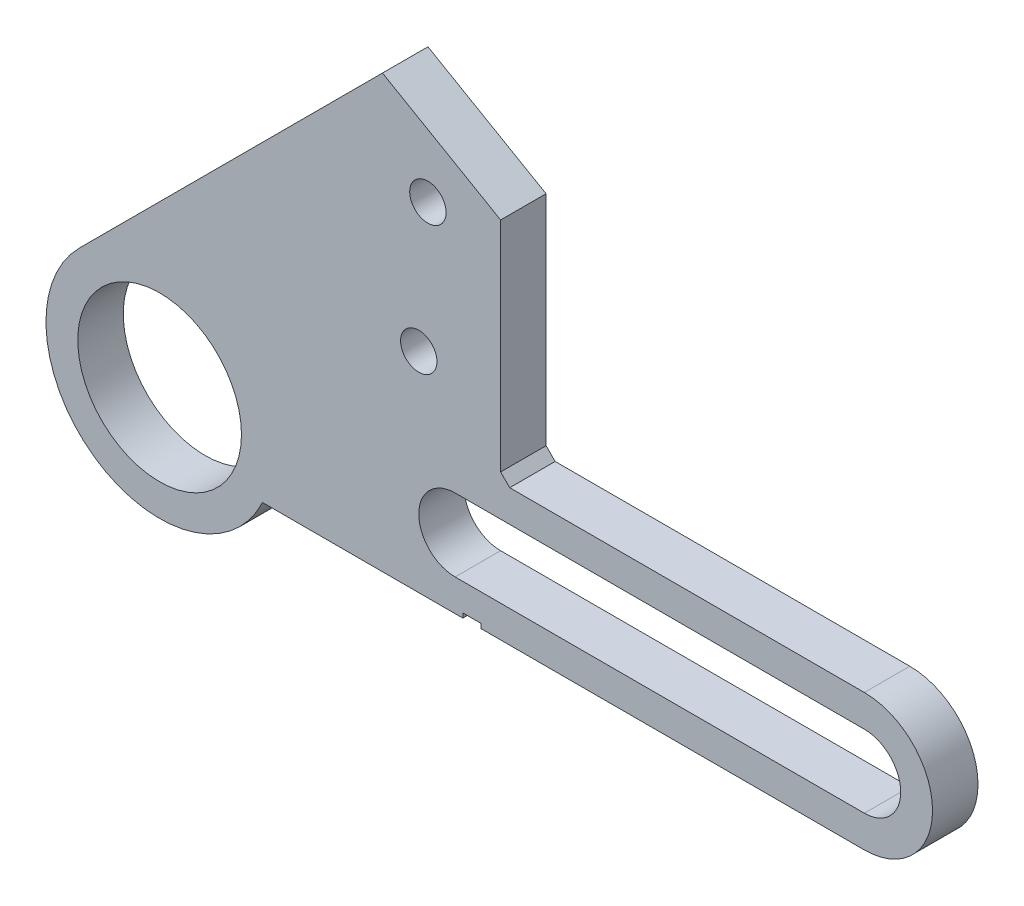
ISO-10303-21;
HEADER;
FILE_DESCRIPTION(('STEP AP214'),'2;1');
FILE_NAME('part.step','',(''),(''),'','','');
FILE_SCHEMA(('AUTOMOTIVE_DESIGN { 1 0 10303 214 1 1 1 1 }'));
ENDSEC;
DATA;
#1=APPLICATION_CONTEXT('core data for automotive mechanical design processes');
#2=APPLICATION_PROTOCOL_DEFINITION('international standard','automotive_design',2000,#1);
#3=PRODUCT_CONTEXT('',#1,'mechanical');
#4=PRODUCT('Part','Part','',(#3));
#5=PRODUCT_RELATED_PRODUCT_CATEGORY('part','',(#4));
#6=PRODUCT_DEFINITION_FORMATION('','',#4);
#7=PRODUCT_DEFINITION_CONTEXT('part definition',#1,'design');
#8=PRODUCT_DEFINITION('design','',#6,#7);
#9=PRODUCT_DEFINITION_SHAPE('','',#8);
#10=(LENGTH_UNIT() NAMED_UNIT(*) SI_UNIT(.MILLI.,.METRE.));
#11=(NAMED_UNIT(*) PLANE_ANGLE_UNIT() SI_UNIT($,.RADIAN.));
#12=(NAMED_UNIT(*) SI_UNIT($,.STERADIAN.) SOLID_ANGLE_UNIT());
#13=UNCERTAINTY_MEASURE_WITH_UNIT(LENGTH_MEASURE(1.E-05),#10,'distance_accuracy_value','');
#14=(GEOMETRIC_REPRESENTATION_CONTEXT(3) GLOBAL_UNCERTAINTY_ASSIGNED_CONTEXT((#13)) GLOBAL_UNIT_ASSIGNED_CONTEXT((#10,
#11,#12)) REPRESENTATION_CONTEXT('',''));
#15=CARTESIAN_POINT('',(0.,0.,0.));
#16=DIRECTION('',(0.,0.,1.));
#17=DIRECTION('',(1.,0.,0.));
#18=AXIS2_PLACEMENT_3D('',#15,#16,#17);
#19=CARTESIAN_POINT('',(11.3148175517677,-5.31271152710273,5.));
#20=DIRECTION('',(0.,1.,0.));
#21=DIRECTION('',(0.,0.,1.));
#22=AXIS2_PLACEMENT_3D('',#19,#20,#21);
#23=PLANE('',#22);
#24=DIRECTION('',(1.,0.,0.));
#25=VECTOR('',#24,1.);
#26=CARTESIAN_POINT('',(11.3148175517677,-5.31271152710273,0.));
#27=LINE('',#26,#25);
#28=CARTESIAN_POINT('',(11.3148175517677,-5.31271152710273,0.));
#29=VERTEX_POINT('',#28);
#30=CARTESIAN_POINT('',(33.3435858680399,-5.31271152710273,0.));
#31=VERTEX_POINT('',#30);
#32=EDGE_CURVE('E255',#29,#31,#27,.T.);
#33=ORIENTED_EDGE('',*,*,#32,.T.);
#34=DIRECTION('',(0.,0.,1.));
#35=VECTOR('',#34,1.);
#36=CARTESIAN_POINT('',(33.3435858680399,-5.31271152710273,5.));
#37=LINE('',#36,#35);
#38=CARTESIAN_POINT('',(33.3435858680399,-5.31271152710273,5.));
#39=VERTEX_POINT('',#38);
#40=EDGE_CURVE('E11',#31,#39,#37,.T.);
#41=ORIENTED_EDGE('',*,*,#40,.T.);
#42=DIRECTION('',(1.,0.,0.));
#43=VECTOR('',#42,1.);
#44=CARTESIAN_POINT('',(11.3148175517677,-5.31271152710273,5.));
#45=LINE('',#44,#43);
#46=CARTESIAN_POINT('',(11.3148175517677,-5.31271152710273,5.));
#47=VERTEX_POINT('',#46);
#48=EDGE_CURVE('E238',#47,#39,#45,.T.);
#49=ORIENTED_EDGE('',*,*,#48,.F.);
#50=DIRECTION('',(0.,0.,-1.));
#51=VECTOR('',#50,1.);
#52=CARTESIAN_POINT('',(11.3148175517677,-5.31271152710273,5.));
#53=LINE('',#52,#51);
#54=EDGE_CURVE('E270',#47,#29,#53,.T.);
#55=ORIENTED_EDGE('',*,*,#54,.T.);
#56=EDGE_LOOP('',(#33,#41,#49,#55));
#57=FACE_BOUND('',#56,.T.);
#58=ADVANCED_FACE('F33',(#57),#23,.F.);
#59=CARTESIAN_POINT('',(0.,0.,5.));
#60=DIRECTION('',(0.,0.,1.));
#61=DIRECTION('',(1.,0.,0.));
#62=AXIS2_PLACEMENT_3D('',#59,#60,#61);
#63=PLANE('',#62);
#64=DIRECTION('',(0.,-1.,0.));
#65=VECTOR('',#64,1.);
#66=CARTESIAN_POINT('',(33.3435858680399,0.,5.));
#67=LINE('',#66,#65);
#68=CARTESIAN_POINT('',(33.3435858680399,-4.81271152710273,5.));
#69=VERTEX_POINT('',#68);
#70=EDGE_CURVE('E176',#69,#39,#67,.T.);
#71=ORIENTED_EDGE('',*,*,#70,.F.);
#72=DIRECTION('',(-1.,0.,0.));
#73=VECTOR('',#72,1.);
#74=CARTESIAN_POINT('',(0.,-4.81271152710271,5.));
#75=LINE('',#74,#73);
#76=CARTESIAN_POINT('',(35.3435858680399,-4.81271152710273,5.));
#77=VERTEX_POINT('',#76);
#78=EDGE_CURVE('E155',#77,#69,#75,.T.);
#79=ORIENTED_EDGE('',*,*,#78,.F.);
#80=DIRECTION('',(0.,1.,0.));
#81=VECTOR('',#80,1.);
#82=CARTESIAN_POINT('',(35.3435858680399,0.,5.));
#83=LINE('',#82,#81);
#84=CARTESIAN_POINT('',(35.3435858680399,-5.31271152710273,5.));
#85=VERTEX_POINT('',#84);
#86=EDGE_CURVE('E173',#85,#77,#83,.T.);
#87=ORIENTED_EDGE('',*,*,#86,.F.);
#88=CARTESIAN_POINT('',(77.5,-5.31271152710273,5.));
#89=VERTEX_POINT('',#88);
#90=EDGE_CURVE('E237',#85,#89,#45,.T.);
#91=ORIENTED_EDGE('',*,*,#90,.T.);
#92=CARTESIAN_POINT('',(77.5,2.18728847289727,5.));
#93=DIRECTION('',(0.,0.,1.));
#94=DIRECTION('',(1.,0.,0.));
#95=AXIS2_PLACEMENT_3D('',#92,#93,#94);
#96=CIRCLE('',#95,7.5);
#97=CARTESIAN_POINT('',(77.5,9.68728847289727,5.));
#98=VERTEX_POINT('',#97);
#99=EDGE_CURVE('E241',#89,#98,#96,.T.);
#100=ORIENTED_EDGE('',*,*,#99,.T.);
#101=DIRECTION('',(-1.,0.,0.));
#102=VECTOR('',#101,1.);
#103=CARTESIAN_POINT('',(37.5,9.68728847289727,5.));
#104=LINE('',#103,#102);
#105=CARTESIAN_POINT('',(38.5,9.68728847289727,5.));
#106=VERTEX_POINT('',#105);
#107=EDGE_CURVE('E243',#98,#106,#104,.T.);
#108=ORIENTED_EDGE('',*,*,#107,.T.);
#109=DIRECTION('',(0.707106781186543,-0.707106781186552,0.));
#110=VECTOR('',#109,1.);
#111=CARTESIAN_POINT('',(37.5,10.6872884728973,5.));
#112=LINE('',#111,#110);
#113=CARTESIAN_POINT('',(37.5,10.6872884728973,5.));
#114=VERTEX_POINT('',#113);
#115=EDGE_CURVE('E285',#106,#114,#112,.F.);
#116=ORIENTED_EDGE('',*,*,#115,.T.);
#117=DIRECTION('',(0.,1.,0.));
#118=VECTOR('',#117,1.);
#119=CARTESIAN_POINT('',(37.5,34.6872884728973,5.));
#120=LINE('',#119,#118);
#121=CARTESIAN_POINT('',(37.5,34.6872884728973,5.));
#122=VERTEX_POINT('',#121);
#123=EDGE_CURVE('E245',#114,#122,#120,.T.);
#124=ORIENTED_EDGE('',*,*,#123,.T.);
#125=DIRECTION('',(-0.866025403784442,0.499999999999994,0.));
#126=VECTOR('',#125,1.);
#127=CARTESIAN_POINT('',(37.5,34.6872884728973,5.));
#128=LINE('',#127,#126);
#129=CARTESIAN_POINT('',(24.5096189432334,42.1872884728972,5.));
#130=VERTEX_POINT('',#129);
#131=EDGE_CURVE('E229',#122,#130,#128,.T.);
#132=ORIENTED_EDGE('',*,*,#131,.T.);
#133=DIRECTION('',(-0.707106781186546,-0.707106781186549,0.));
#134=VECTOR('',#133,1.);
#135=CARTESIAN_POINT('',(-8.83883476483186,8.83883476483183,5.));
#136=LINE('',#135,#134);
#137=CARTESIAN_POINT('',(-8.83883476483187,8.83883476483183,5.));
#138=VERTEX_POINT('',#137);
#139=EDGE_CURVE('E232',#130,#138,#136,.T.);
#140=ORIENTED_EDGE('',*,*,#139,.T.);
#141=CARTESIAN_POINT('',(0.,0.,5.));
#142=DIRECTION('',(0.,0.,1.));
#143=DIRECTION('',(1.,0.,0.));
#144=AXIS2_PLACEMENT_3D('',#141,#142,#143);
#145=CIRCLE('',#144,12.5);
#146=EDGE_CURVE('E235',#138,#47,#145,.T.);
#147=ORIENTED_EDGE('',*,*,#146,.T.);
#148=ORIENTED_EDGE('',*,*,#48,.T.);
#149=EDGE_LOOP('',(#71,#79,#87,#91,#100,#108,#116,#124,#132,#140,#147,#148));
#150=FACE_BOUND('',#149,.T.);
#151=CARTESIAN_POINT('',(28.5,17.6872884728973,5.));
#152=DIRECTION('',(0.,0.,-1.));
#153=DIRECTION('',(-1.,0.,0.));
#154=AXIS2_PLACEMENT_3D('',#151,#152,#153);
#155=CIRCLE('',#154,2.);
#156=CARTESIAN_POINT('',(26.5,17.6872884728973,5.));
#157=VERTEX_POINT('',#156);
#158=EDGE_CURVE('E180',#157,#157,#155,.T.);
#159=ORIENTED_EDGE('',*,*,#158,.T.);
#160=EDGE_LOOP('',(#159));
#161=FACE_BOUND('',#160,.T.);
#162=CARTESIAN_POINT('',(29.5,32.3842269295963,5.));
#163=DIRECTION('',(0.,0.,-1.));
#164=DIRECTION('',(-1.,0.,0.));
#165=AXIS2_PLACEMENT_3D('',#162,#163,#164);
#166=CIRCLE('',#165,2.);
#167=CARTESIAN_POINT('',(27.5,32.3842269295963,5.));
#168=VERTEX_POINT('',#167);
#169=EDGE_CURVE('E187',#168,#168,#166,.T.);
#170=ORIENTED_EDGE('',*,*,#169,.T.);
#171=EDGE_LOOP('',(#170));
#172=FACE_BOUND('',#171,.T.);
#173=DIRECTION('',(1.,0.,0.));
#174=VECTOR('',#173,1.);
#175=CARTESIAN_POINT('',(77.5,-1.81271152710273,5.));
#176=LINE('',#175,#174);
#177=CARTESIAN_POINT('',(32.5,-1.81271152710273,5.));
#178=VERTEX_POINT('',#177);
#179=CARTESIAN_POINT('',(77.5,-1.81271152710273,5.));
#180=VERTEX_POINT('',#179);
#181=EDGE_CURVE('E200',#178,#180,#176,.T.);
#182=ORIENTED_EDGE('',*,*,#181,.F.);
#183=CARTESIAN_POINT('',(32.5,2.18728847289727,5.));
#184=DIRECTION('',(0.,0.,1.));
#185=DIRECTION('',(1.,0.,0.));
#186=AXIS2_PLACEMENT_3D('',#183,#184,#185);
#187=CIRCLE('',#186,4.00000000000003);
#188=CARTESIAN_POINT('',(32.4999992793824,6.18728847289727,5.));
#189=VERTEX_POINT('',#188);
#190=EDGE_CURVE('E198',#189,#178,#187,.T.);
#191=ORIENTED_EDGE('',*,*,#190,.F.);
#192=DIRECTION('',(-1.,0.,0.));
#193=VECTOR('',#192,1.);
#194=CARTESIAN_POINT('',(77.5,6.18728847289727,5.));
#195=LINE('',#194,#193);
#196=CARTESIAN_POINT('',(77.5,6.18728847289727,5.));
#197=VERTEX_POINT('',#196);
#198=EDGE_CURVE('E206',#197,#189,#195,.T.);
#199=ORIENTED_EDGE('',*,*,#198,.F.);
#200=CARTESIAN_POINT('',(77.5,2.18728847289727,5.));
#201=DIRECTION('',(0.,0.,1.));
#202=DIRECTION('',(1.,0.,0.));
#203=AXIS2_PLACEMENT_3D('',#200,#201,#202);
#204=CIRCLE('',#203,4.);
#205=EDGE_CURVE('E203',#180,#197,#204,.T.);
#206=ORIENTED_EDGE('',*,*,#205,.F.);
#207=EDGE_LOOP('',(#182,#191,#199,#206));
#208=FACE_BOUND('',#207,.T.);
#209=CARTESIAN_POINT('',(0.,0.,5.));
#210=DIRECTION('',(0.,0.,1.));
#211=DIRECTION('',(1.,0.,0.));
#212=AXIS2_PLACEMENT_3D('',#209,#210,#211);
#213=CIRCLE('',#212,9.00000000000002);
#214=CARTESIAN_POINT('',(9.00000000000002,0.,5.));
#215=VERTEX_POINT('',#214);
#216=EDGE_CURVE('E192',#215,#215,#213,.T.);
#217=ORIENTED_EDGE('',*,*,#216,.F.);
#218=EDGE_LOOP('',(#217));
#219=FACE_BOUND('',#218,.T.);
#220=ADVANCED_FACE('F300',(#150,#161,#172,#208,#219),#63,.T.);
#221=CARTESIAN_POINT('',(0.,0.,0.));
#222=DIRECTION('',(0.,0.,1.));
#223=DIRECTION('',(1.,0.,0.));
#224=AXIS2_PLACEMENT_3D('',#221,#222,#223);
#225=PLANE('',#224);
#226=CARTESIAN_POINT('',(28.5,17.6872884728973,0.));
#227=DIRECTION('',(0.,0.,-1.));
#228=DIRECTION('',(-1.,0.,0.));
#229=AXIS2_PLACEMENT_3D('',#226,#227,#228);
#230=CIRCLE('',#229,2.);
#231=CARTESIAN_POINT('',(26.5,17.6872884728973,0.));
#232=VERTEX_POINT('',#231);
#233=EDGE_CURVE('E184',#232,#232,#230,.T.);
#234=ORIENTED_EDGE('',*,*,#233,.F.);
#235=EDGE_LOOP('',(#234));
#236=FACE_BOUND('',#235,.T.);
#237=CARTESIAN_POINT('',(29.5,32.3842269295963,0.));
#238=DIRECTION('',(0.,0.,-1.));
#239=DIRECTION('',(-1.,0.,0.));
#240=AXIS2_PLACEMENT_3D('',#237,#238,#239);
#241=CIRCLE('',#240,2.);
#242=CARTESIAN_POINT('',(27.5,32.3842269295963,0.));
#243=VERTEX_POINT('',#242);
#244=EDGE_CURVE('E179',#243,#243,#241,.T.);
#245=ORIENTED_EDGE('',*,*,#244,.F.);
#246=EDGE_LOOP('',(#245));
#247=FACE_BOUND('',#246,.T.);
#248=DIRECTION('',(1.,0.,0.));
#249=VECTOR('',#248,1.);
#250=CARTESIAN_POINT('',(33.3435858680399,-4.81271152710273,0.));
#251=LINE('',#250,#249);
#252=CARTESIAN_POINT('',(33.3435858680399,-4.81271152710273,0.));
#253=VERTEX_POINT('',#252);
#254=CARTESIAN_POINT('',(35.3435858680399,-4.81271152710273,0.));
#255=VERTEX_POINT('',#254);
#256=EDGE_CURVE('E153',#253,#255,#251,.T.);
#257=ORIENTED_EDGE('',*,*,#256,.F.);
#258=DIRECTION('',(0.,1.,0.));
#259=VECTOR('',#258,1.);
#260=CARTESIAN_POINT('',(33.3435858680399,-5.31271152710273,0.));
#261=LINE('',#260,#259);
#262=EDGE_CURVE('E161',#31,#253,#261,.T.);
#263=ORIENTED_EDGE('',*,*,#262,.F.);
#264=ORIENTED_EDGE('',*,*,#32,.F.);
#265=CARTESIAN_POINT('',(0.,0.,0.));
#266=DIRECTION('',(0.,0.,1.));
#267=DIRECTION('',(1.,0.,0.));
#268=AXIS2_PLACEMENT_3D('',#265,#266,#267);
#269=CIRCLE('',#268,12.5);
#270=CARTESIAN_POINT('',(-8.83883476483187,8.83883476483183,0.));
#271=VERTEX_POINT('',#270);
#272=EDGE_CURVE('E252',#271,#29,#269,.T.);
#273=ORIENTED_EDGE('',*,*,#272,.F.);
#274=DIRECTION('',(-0.707106781186546,-0.707106781186549,0.));
#275=VECTOR('',#274,1.);
#276=CARTESIAN_POINT('',(-8.83883476483186,8.83883476483183,0.));
#277=LINE('',#276,#275);
#278=CARTESIAN_POINT('',(24.5096189432334,42.1872884728972,0.));
#279=VERTEX_POINT('',#278);
#280=EDGE_CURVE('E250',#279,#271,#277,.T.);
#281=ORIENTED_EDGE('',*,*,#280,.F.);
#282=DIRECTION('',(-0.866025403784442,0.499999999999994,0.));
#283=VECTOR('',#282,1.);
#284=CARTESIAN_POINT('',(37.5,34.6872884728973,0.));
#285=LINE('',#284,#283);
#286=CARTESIAN_POINT('',(37.5,34.6872884728973,0.));
#287=VERTEX_POINT('',#286);
#288=EDGE_CURVE('E228',#287,#279,#285,.T.);
#289=ORIENTED_EDGE('',*,*,#288,.F.);
#290=DIRECTION('',(0.,1.,0.));
#291=VECTOR('',#290,1.);
#292=CARTESIAN_POINT('',(37.5,34.6872884728973,0.));
#293=LINE('',#292,#291);
#294=CARTESIAN_POINT('',(37.5,10.6872884728973,0.));
#295=VERTEX_POINT('',#294);
#296=EDGE_CURVE('E233',#295,#287,#293,.T.);
#297=ORIENTED_EDGE('',*,*,#296,.F.);
#298=DIRECTION('',(-0.707106781186543,0.707106781186552,0.));
#299=VECTOR('',#298,1.);
#300=CARTESIAN_POINT('',(24.0936442364489,24.0936442364486,0.));
#301=LINE('',#300,#299);
#302=CARTESIAN_POINT('',(38.5,9.68728847289727,0.));
#303=VERTEX_POINT('',#302);
#304=EDGE_CURVE('E283',#295,#303,#301,.F.);
#305=ORIENTED_EDGE('',*,*,#304,.T.);
#306=DIRECTION('',(-1.,0.,0.));
#307=VECTOR('',#306,1.);
#308=CARTESIAN_POINT('',(37.5,9.68728847289727,0.));
#309=LINE('',#308,#307);
#310=CARTESIAN_POINT('',(77.5,9.68728847289727,0.));
#311=VERTEX_POINT('',#310);
#312=EDGE_CURVE('E259',#311,#303,#309,.T.);
#313=ORIENTED_EDGE('',*,*,#312,.F.);
#314=CARTESIAN_POINT('',(77.5,2.18728847289727,0.));
#315=DIRECTION('',(0.,0.,1.));
#316=DIRECTION('',(1.,0.,0.));
#317=AXIS2_PLACEMENT_3D('',#314,#315,#316);
#318=CIRCLE('',#317,7.5);
#319=CARTESIAN_POINT('',(77.5,-5.31271152710273,0.));
#320=VERTEX_POINT('',#319);
#321=EDGE_CURVE('E257',#320,#311,#318,.T.);
#322=ORIENTED_EDGE('',*,*,#321,.F.);
#323=CARTESIAN_POINT('',(35.3435858680398,-5.31271152710273,0.));
#324=VERTEX_POINT('',#323);
#325=EDGE_CURVE('E254',#324,#320,#27,.T.);
#326=ORIENTED_EDGE('',*,*,#325,.F.);
#327=DIRECTION('',(0.,-1.,0.));
#328=VECTOR('',#327,1.);
#329=CARTESIAN_POINT('',(35.3435858680399,-5.31271152710273,0.));
#330=LINE('',#329,#328);
#331=EDGE_CURVE('E48',#255,#324,#330,.T.);
#332=ORIENTED_EDGE('',*,*,#331,.F.);
#333=EDGE_LOOP('',(#257,#263,#264,#273,#281,#289,#297,#305,#313,#322,#326,#332));
#334=FACE_BOUND('',#333,.T.);
#335=CARTESIAN_POINT('',(32.5,2.18728847289727,0.));
#336=DIRECTION('',(0.,0.,1.));
#337=DIRECTION('',(1.,0.,0.));
#338=AXIS2_PLACEMENT_3D('',#335,#336,#337);
#339=CIRCLE('',#338,4.00000000000003);
#340=CARTESIAN_POINT('',(32.4999992793824,6.18728847289727,0.));
#341=VERTEX_POINT('',#340);
#342=CARTESIAN_POINT('',(32.5,-1.81271152710273,0.));
#343=VERTEX_POINT('',#342);
#344=EDGE_CURVE('E195',#341,#343,#339,.T.);
#345=ORIENTED_EDGE('',*,*,#344,.T.);
#346=DIRECTION('',(1.,0.,0.));
#347=VECTOR('',#346,1.);
#348=CARTESIAN_POINT('',(77.5,-1.81271152710273,0.));
#349=LINE('',#348,#347);
#350=CARTESIAN_POINT('',(77.5,-1.81271152710273,0.));
#351=VERTEX_POINT('',#350);
#352=EDGE_CURVE('E211',#343,#351,#349,.T.);
#353=ORIENTED_EDGE('',*,*,#352,.T.);
#354=CARTESIAN_POINT('',(77.5,2.18728847289727,0.));
#355=DIRECTION('',(0.,0.,1.));
#356=DIRECTION('',(1.,0.,0.));
#357=AXIS2_PLACEMENT_3D('',#354,#355,#356);
#358=CIRCLE('',#357,4.);
#359=CARTESIAN_POINT('',(77.5,6.18728847289727,0.));
#360=VERTEX_POINT('',#359);
#361=EDGE_CURVE('E214',#351,#360,#358,.T.);
#362=ORIENTED_EDGE('',*,*,#361,.T.);
#363=DIRECTION('',(-1.,0.,0.));
#364=VECTOR('',#363,1.);
#365=CARTESIAN_POINT('',(77.5,6.18728847289727,0.));
#366=LINE('',#365,#364);
#367=EDGE_CURVE('E201',#360,#341,#366,.T.);
#368=ORIENTED_EDGE('',*,*,#367,.T.);
#369=EDGE_LOOP('',(#345,#353,#362,#368));
#370=FACE_BOUND('',#369,.T.);
#371=CARTESIAN_POINT('',(0.,0.,0.));
#372=DIRECTION('',(0.,0.,1.));
#373=DIRECTION('',(1.,0.,0.));
#374=AXIS2_PLACEMENT_3D('',#371,#372,#373);
#375=CIRCLE('',#374,9.00000000000002);
#376=CARTESIAN_POINT('',(9.00000000000002,0.,0.));
#377=VERTEX_POINT('',#376);
#378=EDGE_CURVE('E183',#377,#377,#375,.T.);
#379=ORIENTED_EDGE('',*,*,#378,.T.);
#380=EDGE_LOOP('',(#379));
#381=FACE_BOUND('',#380,.T.);
#382=ADVANCED_FACE('F167',(#236,#247,#334,#370,#381),#225,.F.);
#383=CARTESIAN_POINT('',(37.5,34.6872884728973,5.));
#384=DIRECTION('',(-0.499999999999994,-0.866025403784442,0.));
#385=DIRECTION('',(0.866025403784442,-0.499999999999994,0.));
#386=AXIS2_PLACEMENT_3D('',#383,#384,#385);
#387=PLANE('',#386);
#388=ORIENTED_EDGE('',*,*,#288,.T.);
#389=DIRECTION('',(0.,0.,-1.));
#390=VECTOR('',#389,1.);
#391=CARTESIAN_POINT('',(24.5096189432334,42.1872884728972,5.));
#392=LINE('',#391,#390);
#393=EDGE_CURVE('E276',#130,#279,#392,.T.);
#394=ORIENTED_EDGE('',*,*,#393,.F.);
#395=ORIENTED_EDGE('',*,*,#131,.F.);
#396=DIRECTION('',(0.,0.,-1.));
#397=VECTOR('',#396,1.);
#398=CARTESIAN_POINT('',(37.5,34.6872884728973,5.));
#399=LINE('',#398,#397);
#400=EDGE_CURVE('E247',#122,#287,#399,.T.);
#401=ORIENTED_EDGE('',*,*,#400,.T.);
#402=EDGE_LOOP('',(#388,#394,#395,#401));
#403=FACE_BOUND('',#402,.T.);
#404=ADVANCED_FACE('F313',(#403),#387,.F.);
#405=CARTESIAN_POINT('',(-8.83883476483186,8.83883476483183,5.));
#406=DIRECTION('',(0.707106781186549,-0.707106781186546,0.));
#407=DIRECTION('',(0.707106781186546,0.707106781186549,0.));
#408=AXIS2_PLACEMENT_3D('',#405,#406,#407);
#409=PLANE('',#408);
#410=ORIENTED_EDGE('',*,*,#280,.T.);
#411=DIRECTION('',(0.,0.,-1.));
#412=VECTOR('',#411,1.);
#413=CARTESIAN_POINT('',(-8.83883476483187,8.83883476483183,5.));
#414=LINE('',#413,#412);
#415=EDGE_CURVE('E273',#138,#271,#414,.T.);
#416=ORIENTED_EDGE('',*,*,#415,.F.);
#417=ORIENTED_EDGE('',*,*,#139,.F.);
#418=ORIENTED_EDGE('',*,*,#393,.T.);
#419=EDGE_LOOP('',(#410,#416,#417,#418));
#420=FACE_BOUND('',#419,.T.);
#421=ADVANCED_FACE('F319',(#420),#409,.F.);
#422=CARTESIAN_POINT('',(0.,0.,5.));
#423=DIRECTION('',(0.,0.,-1.));
#424=DIRECTION('',(-1.,0.,0.));
#425=AXIS2_PLACEMENT_3D('',#422,#423,#424);
#426=CYLINDRICAL_SURFACE('',#425,12.5);
#427=ORIENTED_EDGE('',*,*,#272,.T.);
#428=ORIENTED_EDGE('',*,*,#54,.F.);
#429=ORIENTED_EDGE('',*,*,#146,.F.);
#430=ORIENTED_EDGE('',*,*,#415,.T.);
#431=EDGE_LOOP('',(#427,#428,#429,#430));
#432=FACE_BOUND('',#431,.T.);
#433=ADVANCED_FACE('F321',(#432),#426,.T.);
#434=ORIENTED_EDGE('',*,*,#90,.F.);
#435=DIRECTION('',(0.,0.,-1.));
#436=VECTOR('',#435,1.);
#437=CARTESIAN_POINT('',(35.3435858680399,-5.31271152710273,5.));
#438=LINE('',#437,#436);
#439=EDGE_CURVE('E41',#85,#324,#438,.T.);
#440=ORIENTED_EDGE('',*,*,#439,.T.);
#441=ORIENTED_EDGE('',*,*,#325,.T.);
#442=DIRECTION('',(0.,0.,-1.));
#443=VECTOR('',#442,1.);
#444=CARTESIAN_POINT('',(77.5,-5.31271152710273,5.));
#445=LINE('',#444,#443);
#446=EDGE_CURVE('E267',#89,#320,#445,.T.);
#447=ORIENTED_EDGE('',*,*,#446,.F.);
#448=EDGE_LOOP('',(#434,#440,#441,#447));
#449=FACE_BOUND('',#448,.T.);
#450=ADVANCED_FACE('F288',(#449),#23,.F.);
#451=CARTESIAN_POINT('',(77.5,2.18728847289727,5.));
#452=DIRECTION('',(0.,0.,-1.));
#453=DIRECTION('',(-1.,0.,0.));
#454=AXIS2_PLACEMENT_3D('',#451,#452,#453);
#455=CYLINDRICAL_SURFACE('',#454,7.5);
#456=ORIENTED_EDGE('',*,*,#321,.T.);
#457=DIRECTION('',(0.,0.,-1.));
#458=VECTOR('',#457,1.);
#459=CARTESIAN_POINT('',(77.5,9.68728847289727,5.));
#460=LINE('',#459,#458);
#461=EDGE_CURVE('E264',#98,#311,#460,.T.);
#462=ORIENTED_EDGE('',*,*,#461,.F.);
#463=ORIENTED_EDGE('',*,*,#99,.F.);
#464=ORIENTED_EDGE('',*,*,#446,.T.);
#465=EDGE_LOOP('',(#456,#462,#463,#464));
#466=FACE_BOUND('',#465,.T.);
#467=ADVANCED_FACE('F295',(#466),#455,.T.);
#468=CARTESIAN_POINT('',(37.5,9.68728847289727,5.));
#469=DIRECTION('',(0.,-1.,0.));
#470=DIRECTION('',(0.,0.,-1.));
#471=AXIS2_PLACEMENT_3D('',#468,#469,#470);
#472=PLANE('',#471);
#473=ORIENTED_EDGE('',*,*,#312,.T.);
#474=DIRECTION('',(0.,0.,1.));
#475=VECTOR('',#474,1.);
#476=CARTESIAN_POINT('',(38.5,9.68728847289727,5.));
#477=LINE('',#476,#475);
#478=EDGE_CURVE('E56',#303,#106,#477,.T.);
#479=ORIENTED_EDGE('',*,*,#478,.T.);
#480=ORIENTED_EDGE('',*,*,#107,.F.);
#481=ORIENTED_EDGE('',*,*,#461,.T.);
#482=EDGE_LOOP('',(#473,#479,#480,#481));
#483=FACE_BOUND('',#482,.T.);
#484=ADVANCED_FACE('F297',(#483),#472,.F.);
#485=CARTESIAN_POINT('',(37.5,34.6872884728973,5.));
#486=DIRECTION('',(-1.,0.,0.));
#487=DIRECTION('',(0.,-1.,0.));
#488=AXIS2_PLACEMENT_3D('',#485,#486,#487);
#489=PLANE('',#488);
#490=ORIENTED_EDGE('',*,*,#123,.F.);
#491=DIRECTION('',(0.,0.,-1.));
#492=VECTOR('',#491,1.);
#493=CARTESIAN_POINT('',(37.5,10.6872884728973,0.));
#494=LINE('',#493,#492);
#495=EDGE_CURVE('E279',#114,#295,#494,.T.);
#496=ORIENTED_EDGE('',*,*,#495,.T.);
#497=ORIENTED_EDGE('',*,*,#296,.T.);
#498=ORIENTED_EDGE('',*,*,#400,.F.);
#499=EDGE_LOOP('',(#490,#496,#497,#498));
#500=FACE_BOUND('',#499,.T.);
#501=ADVANCED_FACE('F307',(#500),#489,.F.);
#502=CARTESIAN_POINT('',(32.5,2.18728847289727,5.));
#503=DIRECTION('',(0.,0.,-1.));
#504=DIRECTION('',(-1.,0.,0.));
#505=AXIS2_PLACEMENT_3D('',#502,#503,#504);
#506=CYLINDRICAL_SURFACE('',#505,4.00000000000003);
#507=ORIENTED_EDGE('',*,*,#344,.F.);
#508=DIRECTION('',(0.,0.,-1.));
#509=VECTOR('',#508,1.);
#510=CARTESIAN_POINT('',(32.4999992793824,6.18728847289727,5.));
#511=LINE('',#510,#509);
#512=EDGE_CURVE('E208',#189,#341,#511,.T.);
#513=ORIENTED_EDGE('',*,*,#512,.F.);
#514=ORIENTED_EDGE('',*,*,#190,.T.);
#515=DIRECTION('',(0.,0.,-1.));
#516=VECTOR('',#515,1.);
#517=CARTESIAN_POINT('',(32.5,-1.81271152710273,5.));
#518=LINE('',#517,#516);
#519=EDGE_CURVE('E225',#178,#343,#518,.T.);
#520=ORIENTED_EDGE('',*,*,#519,.T.);
#521=EDGE_LOOP('',(#507,#513,#514,#520));
#522=FACE_BOUND('',#521,.T.);
#523=ADVANCED_FACE('F364',(#522),#506,.F.);
#524=CARTESIAN_POINT('',(77.5,-1.81271152710273,5.));
#525=DIRECTION('',(0.,1.,0.));
#526=DIRECTION('',(-1.,0.,0.));
#527=AXIS2_PLACEMENT_3D('',#524,#525,#526);
#528=PLANE('',#527);
#529=ORIENTED_EDGE('',*,*,#352,.F.);
#530=ORIENTED_EDGE('',*,*,#519,.F.);
#531=ORIENTED_EDGE('',*,*,#181,.T.);
#532=DIRECTION('',(0.,0.,-1.));
#533=VECTOR('',#532,1.);
#534=CARTESIAN_POINT('',(77.5,-1.81271152710273,5.));
#535=LINE('',#534,#533);
#536=EDGE_CURVE('E223',#180,#351,#535,.T.);
#537=ORIENTED_EDGE('',*,*,#536,.T.);
#538=EDGE_LOOP('',(#529,#530,#531,#537));
#539=FACE_BOUND('',#538,.T.);
#540=ADVANCED_FACE('F382',(#539),#528,.T.);
#541=CARTESIAN_POINT('',(77.5,2.18728847289727,5.));
#542=DIRECTION('',(0.,0.,-1.));
#543=DIRECTION('',(-1.,0.,0.));
#544=AXIS2_PLACEMENT_3D('',#541,#542,#543);
#545=CYLINDRICAL_SURFACE('',#544,4.);
#546=ORIENTED_EDGE('',*,*,#361,.F.);
#547=ORIENTED_EDGE('',*,*,#536,.F.);
#548=ORIENTED_EDGE('',*,*,#205,.T.);
#549=DIRECTION('',(0.,0.,-1.));
#550=VECTOR('',#549,1.);
#551=CARTESIAN_POINT('',(77.5,6.18728847289727,5.));
#552=LINE('',#551,#550);
#553=EDGE_CURVE('E221',#197,#360,#552,.T.);
#554=ORIENTED_EDGE('',*,*,#553,.T.);
#555=EDGE_LOOP('',(#546,#547,#548,#554));
#556=FACE_BOUND('',#555,.T.);
#557=ADVANCED_FACE('F389',(#556),#545,.F.);
#558=CARTESIAN_POINT('',(77.5,6.18728847289727,5.));
#559=DIRECTION('',(0.,-1.,0.));
#560=DIRECTION('',(0.,0.,-1.));
#561=AXIS2_PLACEMENT_3D('',#558,#559,#560);
#562=PLANE('',#561);
#563=ORIENTED_EDGE('',*,*,#367,.F.);
#564=ORIENTED_EDGE('',*,*,#553,.F.);
#565=ORIENTED_EDGE('',*,*,#198,.T.);
#566=ORIENTED_EDGE('',*,*,#512,.T.);
#567=EDGE_LOOP('',(#563,#564,#565,#566));
#568=FACE_BOUND('',#567,.T.);
#569=ADVANCED_FACE('F397',(#568),#562,.T.);
#570=CARTESIAN_POINT('',(0.,0.,5.));
#571=DIRECTION('',(0.,0.,-1.));
#572=DIRECTION('',(-1.,0.,0.));
#573=AXIS2_PLACEMENT_3D('',#570,#571,#572);
#574=CYLINDRICAL_SURFACE('',#573,9.00000000000002);
#575=ORIENTED_EDGE('',*,*,#216,.T.);
#576=EDGE_LOOP('',(#575));
#577=FACE_BOUND('',#576,.T.);
#578=ORIENTED_EDGE('',*,*,#378,.F.);
#579=EDGE_LOOP('',(#578));
#580=FACE_BOUND('',#579,.T.);
#581=ADVANCED_FACE('F405',(#577,#580),#574,.F.);
#582=CARTESIAN_POINT('',(29.5,32.3842269295963,5.));
#583=DIRECTION('',(0.,0.,-1.));
#584=DIRECTION('',(-1.,0.,0.));
#585=AXIS2_PLACEMENT_3D('',#582,#583,#584);
#586=CYLINDRICAL_SURFACE('',#585,2.);
#587=ORIENTED_EDGE('',*,*,#169,.F.);
#588=EDGE_LOOP('',(#587));
#589=FACE_BOUND('',#588,.T.);
#590=ORIENTED_EDGE('',*,*,#244,.T.);
#591=EDGE_LOOP('',(#590));
#592=FACE_BOUND('',#591,.T.);
#593=ADVANCED_FACE('F413',(#589,#592),#586,.F.);
#594=CARTESIAN_POINT('',(28.5,17.6872884728973,5.));
#595=DIRECTION('',(0.,0.,-1.));
#596=DIRECTION('',(-1.,0.,0.));
#597=AXIS2_PLACEMENT_3D('',#594,#595,#596);
#598=CYLINDRICAL_SURFACE('',#597,2.);
#599=ORIENTED_EDGE('',*,*,#158,.F.);
#600=EDGE_LOOP('',(#599));
#601=FACE_BOUND('',#600,.T.);
#602=ORIENTED_EDGE('',*,*,#233,.T.);
#603=EDGE_LOOP('',(#602));
#604=FACE_BOUND('',#603,.T.);
#605=ADVANCED_FACE('F421',(#601,#604),#598,.F.);
#606=CARTESIAN_POINT('',(37.5,10.6872884728973,5.));
#607=DIRECTION('',(0.707106781186552,0.707106781186542,0.));
#608=DIRECTION('',(0.,0.,1.));
#609=AXIS2_PLACEMENT_3D('',#606,#607,#608);
#610=PLANE('',#609);
#611=ORIENTED_EDGE('',*,*,#115,.F.);
#612=ORIENTED_EDGE('',*,*,#478,.F.);
#613=ORIENTED_EDGE('',*,*,#304,.F.);
#614=ORIENTED_EDGE('',*,*,#495,.F.);
#615=EDGE_LOOP('',(#611,#612,#613,#614));
#616=FACE_BOUND('',#615,.T.);
#617=ADVANCED_FACE('F35',(#616),#610,.T.);
#618=CARTESIAN_POINT('',(33.3435858680399,-5.31271152710273,7.));
#619=DIRECTION('',(-1.,0.,0.));
#620=DIRECTION('',(0.,0.,1.));
#621=AXIS2_PLACEMENT_3D('',#618,#619,#620);
#622=PLANE('',#621);
#623=ORIENTED_EDGE('',*,*,#70,.T.);
#624=ORIENTED_EDGE('',*,*,#40,.F.);
#625=ORIENTED_EDGE('',*,*,#262,.T.);
#626=DIRECTION('',(0.,0.,-1.));
#627=VECTOR('',#626,1.);
#628=CARTESIAN_POINT('',(33.3435858680399,-4.81271152710273,7.));
#629=LINE('',#628,#627);
#630=EDGE_CURVE('E148',#69,#253,#629,.T.);
#631=ORIENTED_EDGE('',*,*,#630,.F.);
#632=EDGE_LOOP('',(#623,#624,#625,#631));
#633=FACE_BOUND('',#632,.T.);
#634=ADVANCED_FACE('F162',(#633),#622,.F.);
#635=CARTESIAN_POINT('',(35.3435858680399,-5.31271152710273,7.));
#636=DIRECTION('',(1.,0.,0.));
#637=DIRECTION('',(0.,0.,-1.));
#638=AXIS2_PLACEMENT_3D('',#635,#636,#637);
#639=PLANE('',#638);
#640=ORIENTED_EDGE('',*,*,#86,.T.);
#641=DIRECTION('',(0.,0.,-1.));
#642=VECTOR('',#641,1.);
#643=CARTESIAN_POINT('',(35.3435858680399,-4.81271152710273,7.));
#644=LINE('',#643,#642);
#645=EDGE_CURVE('E158',#77,#255,#644,.T.);
#646=ORIENTED_EDGE('',*,*,#645,.T.);
#647=ORIENTED_EDGE('',*,*,#331,.T.);
#648=ORIENTED_EDGE('',*,*,#439,.F.);
#649=EDGE_LOOP('',(#640,#646,#647,#648));
#650=FACE_BOUND('',#649,.T.);
#651=ADVANCED_FACE('F324',(#650),#639,.F.);
#652=CARTESIAN_POINT('',(33.3435858680399,-4.81271152710273,7.));
#653=DIRECTION('',(0.,1.,0.));
#654=DIRECTION('',(-1.,0.,0.));
#655=AXIS2_PLACEMENT_3D('',#652,#653,#654);
#656=PLANE('',#655);
#657=ORIENTED_EDGE('',*,*,#78,.T.);
#658=ORIENTED_EDGE('',*,*,#630,.T.);
#659=ORIENTED_EDGE('',*,*,#256,.T.);
#660=ORIENTED_EDGE('',*,*,#645,.F.);
#661=EDGE_LOOP('',(#657,#658,#659,#660));
#662=FACE_BOUND('',#661,.T.);
#663=ADVANCED_FACE('F150',(#662),#656,.F.);
#664=CLOSED_SHELL('',(#58,#220,#382,#404,#421,#433,#450,#467,#484,#501,#523,#540,#557,#569,#581,
#593,#605,#617,#634,#651,#663));
#665=MANIFOLD_SOLID_BREP('B2',#664);
#666=ADVANCED_BREP_SHAPE_REPRESENTATION('',(#18,#665),#14);
#667=SHAPE_DEFINITION_REPRESENTATION(#9,#666);
ENDSEC;
END-ISO-10303-21;
